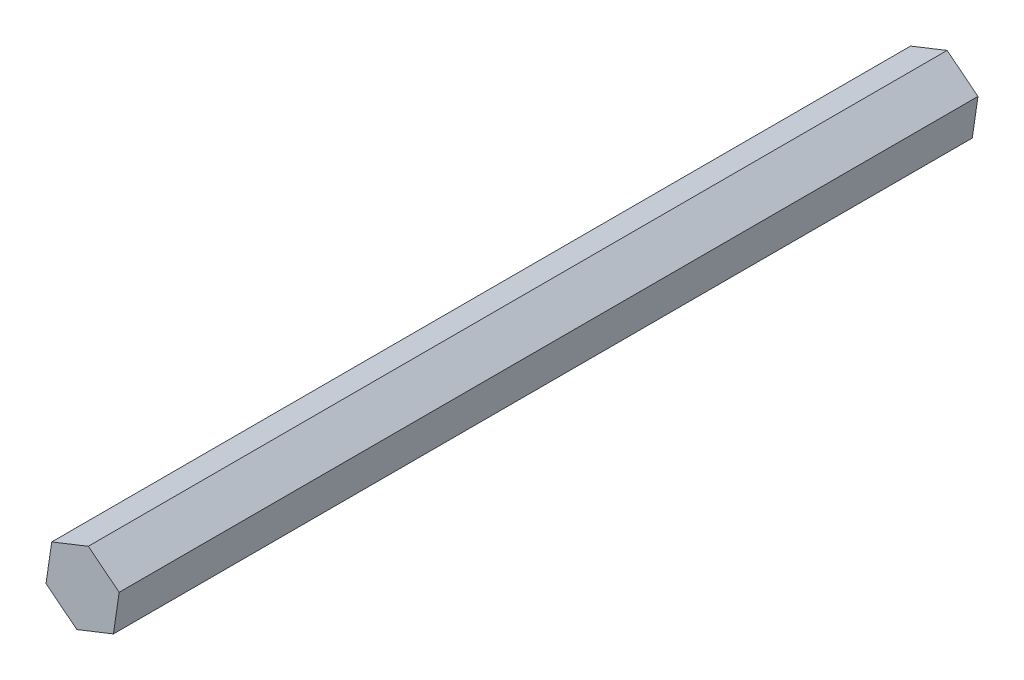
ISO-10303-21;
HEADER;
FILE_DESCRIPTION(('STEP AP214'),'2;1');
FILE_NAME('part.step','',(''),(''),'','','');
FILE_SCHEMA(('AUTOMOTIVE_DESIGN { 1 0 10303 214 1 1 1 1 }'));
ENDSEC;
DATA;
#1=APPLICATION_CONTEXT('core data for automotive mechanical design processes');
#2=APPLICATION_PROTOCOL_DEFINITION('international standard','automotive_design',2000,#1);
#3=PRODUCT_CONTEXT('',#1,'mechanical');
#4=PRODUCT('Part','Part','',(#3));
#5=PRODUCT_RELATED_PRODUCT_CATEGORY('part','',(#4));
#6=PRODUCT_DEFINITION_FORMATION('','',#4);
#7=PRODUCT_DEFINITION_CONTEXT('part definition',#1,'design');
#8=PRODUCT_DEFINITION('design','',#6,#7);
#9=PRODUCT_DEFINITION_SHAPE('','',#8);
#10=(LENGTH_UNIT() NAMED_UNIT(*) SI_UNIT(.MILLI.,.METRE.));
#11=(NAMED_UNIT(*) PLANE_ANGLE_UNIT() SI_UNIT($,.RADIAN.));
#12=(NAMED_UNIT(*) SI_UNIT($,.STERADIAN.) SOLID_ANGLE_UNIT());
#13=UNCERTAINTY_MEASURE_WITH_UNIT(LENGTH_MEASURE(1.E-05),#10,'distance_accuracy_value','');
#14=(GEOMETRIC_REPRESENTATION_CONTEXT(3) GLOBAL_UNCERTAINTY_ASSIGNED_CONTEXT((#13)) GLOBAL_UNIT_ASSIGNED_CONTEXT((#10,
#11,#12)) REPRESENTATION_CONTEXT('',''));
#15=CARTESIAN_POINT('',(0.,0.,0.));
#16=DIRECTION('',(0.,0.,1.));
#17=DIRECTION('',(1.,0.,0.));
#18=AXIS2_PLACEMENT_3D('',#15,#16,#17);
#19=CARTESIAN_POINT('',(6.81512256836031,2.705076285719,160.02));
#20=DIRECTION('',(-0.620473942514407,-0.7842270632034,0.));
#21=DIRECTION('',(0.7842270632034,-0.620473942514407,0.));
#22=AXIS2_PLACEMENT_3D('',#19,#20,#21);
#23=PLANE('',#22);
#24=DIRECTION('',(-0.7842270632034,0.620473942514407,0.));
#25=VECTOR('',#24,1.);
#26=CARTESIAN_POINT('',(6.81512256836031,2.705076285719,0.));
#27=LINE('',#26,#25);
#28=CARTESIAN_POINT('',(6.81512256836031,2.705076285719,0.));
#29=VERTEX_POINT('',#28);
#30=CARTESIAN_POINT('',(1.06489650157265,7.25460741696417,0.));
#31=VERTEX_POINT('',#30);
#32=EDGE_CURVE('E119',#29,#31,#27,.T.);
#33=ORIENTED_EDGE('',*,*,#32,.T.);
#34=DIRECTION('',(0.,0.,-1.));
#35=VECTOR('',#34,1.);
#36=CARTESIAN_POINT('',(1.06489650157265,7.25460741696417,160.02));
#37=LINE('',#36,#35);
#38=CARTESIAN_POINT('',(1.06489650157265,7.25460741696417,160.02));
#39=VERTEX_POINT('',#38);
#40=EDGE_CURVE('E11',#39,#31,#37,.T.);
#41=ORIENTED_EDGE('',*,*,#40,.F.);
#42=DIRECTION('',(-0.7842270632034,0.620473942514407,0.));
#43=VECTOR('',#42,1.);
#44=CARTESIAN_POINT('',(6.81512256836031,2.705076285719,160.02));
#45=LINE('',#44,#43);
#46=CARTESIAN_POINT('',(6.81512256836031,2.705076285719,160.02));
#47=VERTEX_POINT('',#46);
#48=EDGE_CURVE('E129',#47,#39,#45,.T.);
#49=ORIENTED_EDGE('',*,*,#48,.F.);
#50=DIRECTION('',(0.,0.,-1.));
#51=VECTOR('',#50,1.);
#52=CARTESIAN_POINT('',(6.81512256836031,2.705076285719,160.02));
#53=LINE('',#52,#51);
#54=EDGE_CURVE('E115',#47,#29,#53,.T.);
#55=ORIENTED_EDGE('',*,*,#54,.T.);
#56=EDGE_LOOP('',(#33,#41,#49,#55));
#57=FACE_BOUND('',#56,.T.);
#58=ADVANCED_FACE('F35',(#57),#23,.F.);
#59=CARTESIAN_POINT('',(1.06489650157265,7.25460741696417,160.02));
#60=DIRECTION('',(0.368923587812205,-0.929459728205461,0.));
#61=DIRECTION('',(0.929459728205461,0.368923587812205,0.));
#62=AXIS2_PLACEMENT_3D('',#59,#60,#61);
#63=PLANE('',#62);
#64=DIRECTION('',(-0.929459728205461,-0.368923587812205,0.));
#65=VECTOR('',#64,1.);
#66=CARTESIAN_POINT('',(1.06489650157265,7.25460741696417,0.));
#67=LINE('',#66,#65);
#68=CARTESIAN_POINT('',(-5.75022606678766,4.54953113124518,0.));
#69=VERTEX_POINT('',#68);
#70=EDGE_CURVE('E122',#31,#69,#67,.T.);
#71=ORIENTED_EDGE('',*,*,#70,.T.);
#72=DIRECTION('',(0.,0.,-1.));
#73=VECTOR('',#72,1.);
#74=CARTESIAN_POINT('',(-5.75022606678766,4.54953113124518,160.02));
#75=LINE('',#74,#73);
#76=CARTESIAN_POINT('',(-5.75022606678766,4.54953113124518,160.02));
#77=VERTEX_POINT('',#76);
#78=EDGE_CURVE('E43',#77,#69,#75,.T.);
#79=ORIENTED_EDGE('',*,*,#78,.F.);
#80=DIRECTION('',(-0.929459728205461,-0.368923587812205,0.));
#81=VECTOR('',#80,1.);
#82=CARTESIAN_POINT('',(1.06489650157265,7.25460741696417,160.02));
#83=LINE('',#82,#81);
#84=EDGE_CURVE('E88',#39,#77,#83,.T.);
#85=ORIENTED_EDGE('',*,*,#84,.F.);
#86=ORIENTED_EDGE('',*,*,#40,.T.);
#87=EDGE_LOOP('',(#71,#79,#85,#86));
#88=FACE_BOUND('',#87,.T.);
#89=ADVANCED_FACE('F153',(#88),#63,.F.);
#90=CARTESIAN_POINT('',(-5.75022606678766,4.54953113124518,160.02));
#91=DIRECTION('',(0.989397530326612,-0.145232665002061,0.));
#92=DIRECTION('',(0.145232665002061,0.989397530326612,0.));
#93=AXIS2_PLACEMENT_3D('',#90,#91,#92);
#94=PLANE('',#93);
#95=DIRECTION('',(-0.145232665002061,-0.989397530326612,0.));
#96=VECTOR('',#95,1.);
#97=CARTESIAN_POINT('',(-5.75022606678766,4.54953113124518,0.));
#98=LINE('',#97,#96);
#99=CARTESIAN_POINT('',(-6.81512256836031,-2.705076285719,0.));
#100=VERTEX_POINT('',#99);
#101=EDGE_CURVE('E124',#69,#100,#98,.T.);
#102=ORIENTED_EDGE('',*,*,#101,.T.);
#103=DIRECTION('',(0.,0.,-1.));
#104=VECTOR('',#103,1.);
#105=CARTESIAN_POINT('',(-6.81512256836031,-2.705076285719,160.02));
#106=LINE('',#105,#104);
#107=CARTESIAN_POINT('',(-6.81512256836031,-2.705076285719,160.02));
#108=VERTEX_POINT('',#107);
#109=EDGE_CURVE('E110',#108,#100,#106,.T.);
#110=ORIENTED_EDGE('',*,*,#109,.F.);
#111=DIRECTION('',(-0.145232665002061,-0.989397530326612,0.));
#112=VECTOR('',#111,1.);
#113=CARTESIAN_POINT('',(-5.75022606678766,4.54953113124518,160.02));
#114=LINE('',#113,#112);
#115=EDGE_CURVE('E101',#77,#108,#114,.T.);
#116=ORIENTED_EDGE('',*,*,#115,.F.);
#117=ORIENTED_EDGE('',*,*,#78,.T.);
#118=EDGE_LOOP('',(#102,#110,#116,#117));
#119=FACE_BOUND('',#118,.T.);
#120=ADVANCED_FACE('F135',(#119),#94,.F.);
#121=CARTESIAN_POINT('',(-6.81512256836031,-2.705076285719,160.02));
#122=DIRECTION('',(0.620473942514406,0.7842270632034,0.));
#123=DIRECTION('',(-0.7842270632034,0.620473942514407,0.));
#124=AXIS2_PLACEMENT_3D('',#121,#122,#123);
#125=PLANE('',#124);
#126=DIRECTION('',(0.7842270632034,-0.620473942514406,0.));
#127=VECTOR('',#126,1.);
#128=CARTESIAN_POINT('',(-6.81512256836031,-2.705076285719,0.));
#129=LINE('',#128,#127);
#130=CARTESIAN_POINT('',(-1.06489650157265,-7.25460741696418,0.));
#131=VERTEX_POINT('',#130);
#132=EDGE_CURVE('E109',#100,#131,#129,.T.);
#133=ORIENTED_EDGE('',*,*,#132,.T.);
#134=DIRECTION('',(0.,0.,-1.));
#135=VECTOR('',#134,1.);
#136=CARTESIAN_POINT('',(-1.06489650157265,-7.25460741696418,160.02));
#137=LINE('',#136,#135);
#138=CARTESIAN_POINT('',(-1.06489650157265,-7.25460741696418,160.02));
#139=VERTEX_POINT('',#138);
#140=EDGE_CURVE('E106',#139,#131,#137,.T.);
#141=ORIENTED_EDGE('',*,*,#140,.F.);
#142=DIRECTION('',(0.7842270632034,-0.620473942514406,0.));
#143=VECTOR('',#142,1.);
#144=CARTESIAN_POINT('',(-6.81512256836031,-2.705076285719,160.02));
#145=LINE('',#144,#143);
#146=EDGE_CURVE('E95',#108,#139,#145,.T.);
#147=ORIENTED_EDGE('',*,*,#146,.F.);
#148=ORIENTED_EDGE('',*,*,#109,.T.);
#149=EDGE_LOOP('',(#133,#141,#147,#148));
#150=FACE_BOUND('',#149,.T.);
#151=ADVANCED_FACE('F107',(#150),#125,.F.);
#152=CARTESIAN_POINT('',(-1.06489650157265,-7.25460741696418,160.02));
#153=DIRECTION('',(-0.368923587812205,0.929459728205462,0.));
#154=DIRECTION('',(-0.929459728205462,-0.368923587812205,0.));
#155=AXIS2_PLACEMENT_3D('',#152,#153,#154);
#156=PLANE('',#155);
#157=DIRECTION('',(0.929459728205461,0.368923587812205,0.));
#158=VECTOR('',#157,1.);
#159=CARTESIAN_POINT('',(-1.06489650157265,-7.25460741696418,0.));
#160=LINE('',#159,#158);
#161=CARTESIAN_POINT('',(5.75022606678766,-4.54953113124519,0.));
#162=VERTEX_POINT('',#161);
#163=EDGE_CURVE('E74',#131,#162,#160,.T.);
#164=ORIENTED_EDGE('',*,*,#163,.T.);
#165=DIRECTION('',(0.,0.,-1.));
#166=VECTOR('',#165,1.);
#167=CARTESIAN_POINT('',(5.75022606678766,-4.54953113124519,160.02));
#168=LINE('',#167,#166);
#169=CARTESIAN_POINT('',(5.75022606678766,-4.54953113124519,160.02));
#170=VERTEX_POINT('',#169);
#171=EDGE_CURVE('E111',#170,#162,#168,.T.);
#172=ORIENTED_EDGE('',*,*,#171,.F.);
#173=DIRECTION('',(0.929459728205461,0.368923587812205,0.));
#174=VECTOR('',#173,1.);
#175=CARTESIAN_POINT('',(-1.06489650157265,-7.25460741696418,160.02));
#176=LINE('',#175,#174);
#177=EDGE_CURVE('E99',#139,#170,#176,.T.);
#178=ORIENTED_EDGE('',*,*,#177,.F.);
#179=ORIENTED_EDGE('',*,*,#140,.T.);
#180=EDGE_LOOP('',(#164,#172,#178,#179));
#181=FACE_BOUND('',#180,.T.);
#182=ADVANCED_FACE('F113',(#181),#156,.F.);
#183=CARTESIAN_POINT('',(5.75022606678766,-4.54953113124519,160.02));
#184=DIRECTION('',(-0.989397530326612,0.145232665002062,0.));
#185=DIRECTION('',(-0.145232665002062,-0.989397530326612,0.));
#186=AXIS2_PLACEMENT_3D('',#183,#184,#185);
#187=PLANE('',#186);
#188=DIRECTION('',(0.145232665002062,0.989397530326612,0.));
#189=VECTOR('',#188,1.);
#190=CARTESIAN_POINT('',(5.75022606678766,-4.54953113124519,0.));
#191=LINE('',#190,#189);
#192=EDGE_CURVE('E80',#162,#29,#191,.T.);
#193=ORIENTED_EDGE('',*,*,#192,.T.);
#194=ORIENTED_EDGE('',*,*,#54,.F.);
#195=DIRECTION('',(0.145232665002062,0.989397530326612,0.));
#196=VECTOR('',#195,1.);
#197=CARTESIAN_POINT('',(5.75022606678766,-4.54953113124519,160.02));
#198=LINE('',#197,#196);
#199=EDGE_CURVE('E51',#170,#47,#198,.T.);
#200=ORIENTED_EDGE('',*,*,#199,.F.);
#201=ORIENTED_EDGE('',*,*,#171,.T.);
#202=EDGE_LOOP('',(#193,#194,#200,#201));
#203=FACE_BOUND('',#202,.T.);
#204=ADVANCED_FACE('F142',(#203),#187,.F.);
#205=CARTESIAN_POINT('',(0.,0.,160.02));
#206=DIRECTION('',(0.,0.,1.));
#207=DIRECTION('',(1.,0.,0.));
#208=AXIS2_PLACEMENT_3D('',#205,#206,#207);
#209=PLANE('',#208);
#210=ORIENTED_EDGE('',*,*,#48,.T.);
#211=ORIENTED_EDGE('',*,*,#84,.T.);
#212=ORIENTED_EDGE('',*,*,#115,.T.);
#213=ORIENTED_EDGE('',*,*,#146,.T.);
#214=ORIENTED_EDGE('',*,*,#177,.T.);
#215=ORIENTED_EDGE('',*,*,#199,.T.);
#216=EDGE_LOOP('',(#210,#211,#212,#213,#214,#215));
#217=FACE_BOUND('',#216,.T.);
#218=ADVANCED_FACE('F97',(#217),#209,.T.);
#219=CARTESIAN_POINT('',(0.,0.,0.));
#220=DIRECTION('',(0.,0.,1.));
#221=DIRECTION('',(1.,0.,0.));
#222=AXIS2_PLACEMENT_3D('',#219,#220,#221);
#223=PLANE('',#222);
#224=ORIENTED_EDGE('',*,*,#32,.F.);
#225=ORIENTED_EDGE('',*,*,#192,.F.);
#226=ORIENTED_EDGE('',*,*,#163,.F.);
#227=ORIENTED_EDGE('',*,*,#132,.F.);
#228=ORIENTED_EDGE('',*,*,#101,.F.);
#229=ORIENTED_EDGE('',*,*,#70,.F.);
#230=EDGE_LOOP('',(#224,#225,#226,#227,#228,#229));
#231=FACE_BOUND('',#230,.T.);
#232=ADVANCED_FACE('F138',(#231),#223,.F.);
#233=CLOSED_SHELL('',(#58,#89,#120,#151,#182,#204,#218,#232));
#234=MANIFOLD_SOLID_BREP('B2',#233);
#235=ADVANCED_BREP_SHAPE_REPRESENTATION('',(#18,#234),#14);
#236=SHAPE_DEFINITION_REPRESENTATION(#9,#235);
ENDSEC;
END-ISO-10303-21;
